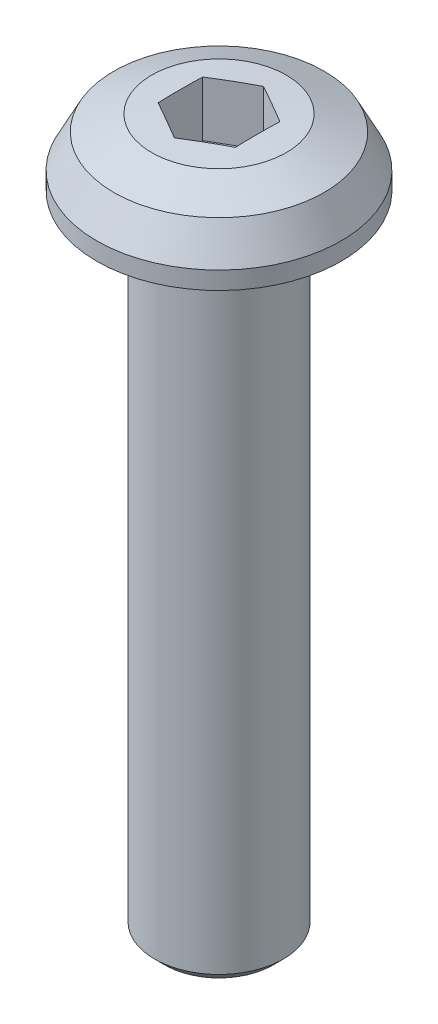
ISO-10303-21;
HEADER;
FILE_DESCRIPTION(('STEP AP214'),'2;1');
FILE_NAME('part.step','',(''),(''),'','','');
FILE_SCHEMA(('AUTOMOTIVE_DESIGN { 1 0 10303 214 1 1 1 1 }'));
ENDSEC;
DATA;
#1=APPLICATION_CONTEXT('core data for automotive mechanical design processes');
#2=APPLICATION_PROTOCOL_DEFINITION('international standard','automotive_design',2000,#1);
#3=PRODUCT_CONTEXT('',#1,'mechanical');
#4=PRODUCT('Part','Part','',(#3));
#5=PRODUCT_RELATED_PRODUCT_CATEGORY('part','',(#4));
#6=PRODUCT_DEFINITION_FORMATION('','',#4);
#7=PRODUCT_DEFINITION_CONTEXT('part definition',#1,'design');
#8=PRODUCT_DEFINITION('design','',#6,#7);
#9=PRODUCT_DEFINITION_SHAPE('','',#8);
#10=(LENGTH_UNIT() NAMED_UNIT(*) SI_UNIT(.MILLI.,.METRE.));
#11=(NAMED_UNIT(*) PLANE_ANGLE_UNIT() SI_UNIT($,.RADIAN.));
#12=(NAMED_UNIT(*) SI_UNIT($,.STERADIAN.) SOLID_ANGLE_UNIT());
#13=UNCERTAINTY_MEASURE_WITH_UNIT(LENGTH_MEASURE(1.E-05),#10,'distance_accuracy_value','');
#14=(GEOMETRIC_REPRESENTATION_CONTEXT(3) GLOBAL_UNCERTAINTY_ASSIGNED_CONTEXT((#13)) GLOBAL_UNIT_ASSIGNED_CONTEXT((#10,
#11,#12)) REPRESENTATION_CONTEXT('',''));
#15=CARTESIAN_POINT('',(0.,0.,0.));
#16=DIRECTION('',(0.,0.,1.));
#17=DIRECTION('',(1.,0.,0.));
#18=AXIS2_PLACEMENT_3D('',#15,#16,#17);
#19=CARTESIAN_POINT('',(0.,-25.,0.));
#20=DIRECTION('',(0.,-1.,0.));
#21=DIRECTION('',(0.,0.,-1.));
#22=AXIS2_PLACEMENT_3D('',#19,#20,#21);
#23=PLANE('',#22);
#24=CARTESIAN_POINT('',(0.,-25.,0.));
#25=DIRECTION('',(0.,-1.,0.));
#26=DIRECTION('',(0.,0.,-1.));
#27=AXIS2_PLACEMENT_3D('',#24,#25,#26);
#28=CIRCLE('',#27,2.1);
#29=CARTESIAN_POINT('',(0.,-25.,-2.1));
#30=VERTEX_POINT('',#29);
#31=EDGE_CURVE('E156',#30,#30,#28,.T.);
#32=ORIENTED_EDGE('',*,*,#31,.T.);
#33=EDGE_LOOP('',(#32));
#34=FACE_BOUND('',#33,.T.);
#35=ADVANCED_FACE('F41',(#34),#23,.T.);
#36=CARTESIAN_POINT('',(0.,-25.,0.));
#37=DIRECTION('',(0.,1.,0.));
#38=DIRECTION('',(0.,0.,1.));
#39=AXIS2_PLACEMENT_3D('',#36,#37,#38);
#40=CONICAL_SURFACE('',#39,2.1,0.785398163397447);
#41=CARTESIAN_POINT('',(0.,-24.6,0.));
#42=DIRECTION('',(0.,-1.,0.));
#43=DIRECTION('',(0.,0.,-1.));
#44=AXIS2_PLACEMENT_3D('',#41,#42,#43);
#45=CIRCLE('',#44,2.5);
#46=CARTESIAN_POINT('',(0.,-24.6,-2.5));
#47=VERTEX_POINT('',#46);
#48=EDGE_CURVE('E153',#47,#47,#45,.T.);
#49=ORIENTED_EDGE('',*,*,#48,.T.);
#50=EDGE_LOOP('',(#49));
#51=FACE_BOUND('',#50,.T.);
#52=ORIENTED_EDGE('',*,*,#31,.F.);
#53=EDGE_LOOP('',(#52));
#54=FACE_BOUND('',#53,.T.);
#55=ADVANCED_FACE('F193',(#51,#54),#40,.T.);
#56=CARTESIAN_POINT('',(0.,-10.,0.));
#57=DIRECTION('',(0.,-1.,0.));
#58=DIRECTION('',(0.,0.,-1.));
#59=AXIS2_PLACEMENT_3D('',#56,#57,#58);
#60=CYLINDRICAL_SURFACE('',#59,2.5);
#61=CARTESIAN_POINT('',(0.,0.,0.));
#62=DIRECTION('',(0.,-1.,0.));
#63=DIRECTION('',(0.,0.,-1.));
#64=AXIS2_PLACEMENT_3D('',#61,#62,#63);
#65=CIRCLE('',#64,2.5);
#66=CARTESIAN_POINT('',(0.,0.,-2.5));
#67=VERTEX_POINT('',#66);
#68=EDGE_CURVE('E150',#67,#67,#65,.T.);
#69=ORIENTED_EDGE('',*,*,#68,.T.);
#70=EDGE_LOOP('',(#69));
#71=FACE_BOUND('',#70,.T.);
#72=ORIENTED_EDGE('',*,*,#48,.F.);
#73=EDGE_LOOP('',(#72));
#74=FACE_BOUND('',#73,.T.);
#75=ADVANCED_FACE('F198',(#71,#74),#60,.T.);
#76=CARTESIAN_POINT('',(2.5,0.,0.));
#77=DIRECTION('',(0.,-1.,0.));
#78=DIRECTION('',(0.,0.,-1.));
#79=AXIS2_PLACEMENT_3D('',#76,#77,#78);
#80=PLANE('',#79);
#81=CARTESIAN_POINT('',(0.,0.,0.));
#82=DIRECTION('',(0.,-1.,0.));
#83=DIRECTION('',(0.,0.,-1.));
#84=AXIS2_PLACEMENT_3D('',#81,#82,#83);
#85=CIRCLE('',#84,4.75);
#86=CARTESIAN_POINT('',(0.,0.,-4.75));
#87=VERTEX_POINT('',#86);
#88=EDGE_CURVE('E147',#87,#87,#85,.T.);
#89=ORIENTED_EDGE('',*,*,#88,.T.);
#90=EDGE_LOOP('',(#89));
#91=FACE_BOUND('',#90,.T.);
#92=ORIENTED_EDGE('',*,*,#68,.F.);
#93=EDGE_LOOP('',(#92));
#94=FACE_BOUND('',#93,.T.);
#95=ADVANCED_FACE('F206',(#91,#94),#80,.T.);
#96=CARTESIAN_POINT('',(0.,-10.,0.));
#97=DIRECTION('',(0.,-1.,0.));
#98=DIRECTION('',(0.,0.,-1.));
#99=AXIS2_PLACEMENT_3D('',#96,#97,#98);
#100=CYLINDRICAL_SURFACE('',#99,4.75);
#101=CARTESIAN_POINT('',(0.,0.687500000000001,0.));
#102=DIRECTION('',(0.,-1.,0.));
#103=DIRECTION('',(0.,0.,-1.));
#104=AXIS2_PLACEMENT_3D('',#101,#102,#103);
#105=CIRCLE('',#104,4.75);
#106=CARTESIAN_POINT('',(0.,0.687500000000001,-4.75));
#107=VERTEX_POINT('',#106);
#108=EDGE_CURVE('E144',#107,#107,#105,.T.);
#109=ORIENTED_EDGE('',*,*,#108,.T.);
#110=EDGE_LOOP('',(#109));
#111=FACE_BOUND('',#110,.T.);
#112=ORIENTED_EDGE('',*,*,#88,.F.);
#113=EDGE_LOOP('',(#112));
#114=FACE_BOUND('',#113,.T.);
#115=ADVANCED_FACE('F212',(#111,#114),#100,.T.);
#116=CARTESIAN_POINT('',(0.,0.687500000000001,0.));
#117=DIRECTION('',(0.,-1.,0.));
#118=DIRECTION('',(0.,0.,-1.));
#119=AXIS2_PLACEMENT_3D('',#116,#117,#118);
#120=CONICAL_SURFACE('',#119,4.75,0.475185558518265);
#121=CARTESIAN_POINT('',(0.,1.98,0.));
#122=DIRECTION('',(0.,-1.,0.));
#123=DIRECTION('',(0.,0.,-1.));
#124=AXIS2_PLACEMENT_3D('',#121,#122,#123);
#125=CIRCLE('',#124,4.085);
#126=CARTESIAN_POINT('',(0.,1.98,-4.085));
#127=VERTEX_POINT('',#126);
#128=EDGE_CURVE('E141',#127,#127,#125,.T.);
#129=ORIENTED_EDGE('',*,*,#128,.T.);
#130=EDGE_LOOP('',(#129));
#131=FACE_BOUND('',#130,.T.);
#132=ORIENTED_EDGE('',*,*,#108,.F.);
#133=EDGE_LOOP('',(#132));
#134=FACE_BOUND('',#133,.T.);
#135=ADVANCED_FACE('F216',(#131,#134),#120,.T.);
#136=CARTESIAN_POINT('',(0.,1.98,0.));
#137=DIRECTION('',(0.,-1.,0.));
#138=DIRECTION('',(0.,0.,-1.));
#139=AXIS2_PLACEMENT_3D('',#136,#137,#138);
#140=CONICAL_SURFACE('',#139,4.085,1.18095805376664);
#141=CARTESIAN_POINT('',(0.,2.585,0.));
#142=DIRECTION('',(0.,-1.,0.));
#143=DIRECTION('',(0.,0.,-1.));
#144=AXIS2_PLACEMENT_3D('',#141,#142,#143);
#145=CIRCLE('',#144,2.6125);
#146=CARTESIAN_POINT('',(0.,2.585,-2.6125));
#147=VERTEX_POINT('',#146);
#148=EDGE_CURVE('E129',#147,#147,#145,.T.);
#149=ORIENTED_EDGE('',*,*,#148,.T.);
#150=EDGE_LOOP('',(#149));
#151=FACE_BOUND('',#150,.T.);
#152=ORIENTED_EDGE('',*,*,#128,.F.);
#153=EDGE_LOOP('',(#152));
#154=FACE_BOUND('',#153,.T.);
#155=ADVANCED_FACE('F190',(#151,#154),#140,.T.);
#156=CARTESIAN_POINT('',(0.,2.585,0.));
#157=DIRECTION('',(0.,-1.,0.));
#158=DIRECTION('',(0.,0.,-1.));
#159=AXIS2_PLACEMENT_3D('',#156,#157,#158);
#160=CONICAL_SURFACE('',#159,2.6125,1.50772220889798);
#161=CARTESIAN_POINT('',(1.5,2.560086309188,2.60611764182678));
#162=CARTESIAN_POINT('',(1.5,2.56693880295416,2.48076908626678));
#163=CARTESIAN_POINT('',(1.5,2.57368529872115,2.35541457200931));
#164=CARTESIAN_POINT('',(1.5,2.58683002538783,2.10468586531663));
#165=CARTESIAN_POINT('',(1.5,2.5932282521772,1.97931167266667));
#166=CARTESIAN_POINT('',(1.5,2.60554318572624,1.72847399636716));
#167=CARTESIAN_POINT('',(1.5,2.61145964188796,1.60301050006051));
#168=CARTESIAN_POINT('',(1.5,2.62258337856353,1.35205277534172));
#169=CARTESIAN_POINT('',(1.5,2.62779065640743,1.22655854681567));
#170=CARTESIAN_POINT('',(1.5,2.64184565054799,0.850405596673332));
#171=CARTESIAN_POINT('',(1.5,2.64914799209055,0.599678211841999));
#172=CARTESIAN_POINT('',(1.5,2.65452690718478,0.223533565281367));
#173=CARTESIAN_POINT('',(1.5,2.65539100744672,0.0981579717602855));
#174=CARTESIAN_POINT('',(1.5,2.6551041219456,-0.152590972629411));
#175=CARTESIAN_POINT('',(1.5,2.65395313305011,-0.277964323494237));
#176=CARTESIAN_POINT('',(1.5,2.64888891333641,-0.586915084332876));
#177=CARTESIAN_POINT('',(1.5,2.64394087253405,-0.770474724862048));
#178=CARTESIAN_POINT('',(1.5,2.63151083532879,-1.13753450590357));
#179=CARTESIAN_POINT('',(1.5,2.62402837189799,-1.32103462920576));
#180=CARTESIAN_POINT('',(1.5,2.60760331162556,-1.68818507119781));
#181=CARTESIAN_POINT('',(1.5,2.59865900026496,-1.87183531122401));
#182=CARTESIAN_POINT('',(1.5,2.58460569077659,-2.14724894720027));
#183=CARTESIAN_POINT('',(1.5,2.57981590496685,-2.23902899568071));
#184=CARTESIAN_POINT('',(1.5,2.57006714596731,-2.42257971914173));
#185=CARTESIAN_POINT('',(1.5,2.56510817351475,-2.51435039416143));
#186=CARTESIAN_POINT('',(1.5,2.560086309188,-2.60611764182678));
#187=B_SPLINE_CURVE_WITH_KNOTS('',3,(#161,#162,#163,#164,#165,#166,#167,#168,#169,#170,#171,
#172,#173,#174,#175,#176,#177,#178,#179,#180,#181,#182,#183,#184,#185,#186),.UNSPECIFIED.,.F.,
.F.,(4,2,2,2,2,2,2,2,2,2,2,2,4),(0.,0.376607265441586,0.753218974700062,1.13002534740853,
1.50683313869845,2.25925183627969,2.63537191500764,3.01149257840772,3.56234045527837,
4.11328989430266,4.66489020997614,4.94060497932327,5.21631854740567),.UNSPECIFIED.);
#188=CARTESIAN_POINT('',(1.5,2.6406073174167,0.866025403784439));
#189=VERTEX_POINT('',#188);
#190=CARTESIAN_POINT('',(1.5,2.6406073174167,-0.866025403784438));
#191=VERTEX_POINT('',#190);
#192=EDGE_CURVE('E11',#189,#191,#187,.T.);
#193=ORIENTED_EDGE('',*,*,#192,.F.);
#194=CARTESIAN_POINT('',(-0.000199999999999894,2.64060002384196,1.73216627762272));
#195=CARTESIAN_POINT('',(0.0623052328910305,2.6428788982063,1.69607886458732));
#196=CARTESIAN_POINT('',(0.124816428078966,2.6449454416361,1.6599880092182));
#197=CARTESIAN_POINT('',(0.249851117971786,2.64857076256674,1.58779919735054));
#198=CARTESIAN_POINT('',(0.312374612911773,2.65012952917297,1.55170124071626));
#199=CARTESIAN_POINT('',(0.499922087623552,2.65391859893502,1.44342065570558));
#200=CARTESIAN_POINT('',(0.624961043811776,2.65526315789474,1.37122938069112));
#201=CARTESIAN_POINT('',(0.875038956188224,2.65526315789474,1.2268468306622));
#202=CARTESIAN_POINT('',(1.00007791237645,2.65391859893502,1.15465555564774));
#203=CARTESIAN_POINT('',(1.18762538708823,2.65012952917297,1.04637497063706));
#204=CARTESIAN_POINT('',(1.25014888202821,2.64857076256674,1.01027701400278));
#205=CARTESIAN_POINT('',(1.37518357192103,2.6449454416361,0.938088202135117));
#206=CARTESIAN_POINT('',(1.43769476710897,2.6428788982063,0.901997346765998));
#207=CARTESIAN_POINT('',(1.5002,2.64060002384196,0.865909933730601));
#208=B_SPLINE_CURVE_WITH_KNOTS('',3,(#194,#195,#196,#197,#198,#199,#200,#201,#202,#203,#204,
#205,#206,#207),.UNSPECIFIED.,.F.,.F.,(4,2,2,2,2,2,4),(0.,0.216632117546511,0.43326888273534,
0.866410762592288,1.29955264244924,1.51618940763806,1.73282152518458),.UNSPECIFIED.);
#209=CARTESIAN_POINT('',(0.,2.6406073174167,1.73205080756888));
#210=VERTEX_POINT('',#209);
#211=EDGE_CURVE('E54',#210,#189,#208,.T.);
#212=ORIENTED_EDGE('',*,*,#211,.F.);
#213=CARTESIAN_POINT('',(-1.5002,2.64060002384196,0.865909933730602));
#214=CARTESIAN_POINT('',(-1.43769476710897,2.6428788982063,0.901997346765998));
#215=CARTESIAN_POINT('',(-1.37518357192103,2.6449454416361,0.938088202135118));
#216=CARTESIAN_POINT('',(-1.25014888202821,2.64857076256674,1.01027701400278));
#217=CARTESIAN_POINT('',(-1.18762538708823,2.65012952917297,1.04637497063706));
#218=CARTESIAN_POINT('',(-1.00007791237645,2.65391859893502,1.15465555564774));
#219=CARTESIAN_POINT('',(-0.875038956188224,2.65526315789474,1.2268468306622));
#220=CARTESIAN_POINT('',(-0.624961043811775,2.65526315789474,1.37122938069112));
#221=CARTESIAN_POINT('',(-0.499922087623551,2.65391859893502,1.44342065570558));
#222=CARTESIAN_POINT('',(-0.312374612911772,2.65012952917297,1.55170124071626));
#223=CARTESIAN_POINT('',(-0.249851117971785,2.64857076256674,1.58779919735054));
#224=CARTESIAN_POINT('',(-0.124816428078965,2.6449454416361,1.6599880092182));
#225=CARTESIAN_POINT('',(-0.0623052328910301,2.6428788982063,1.69607886458732));
#226=CARTESIAN_POINT('',(0.000200000000000383,2.64060002384196,1.73216627762272));
#227=B_SPLINE_CURVE_WITH_KNOTS('',3,(#213,#214,#215,#216,#217,#218,#219,#220,#221,#222,#223,
#224,#225,#226),.UNSPECIFIED.,.F.,.F.,(4,2,2,2,2,2,4),(0.,0.216632117546511,0.43326888273534,
0.866410762592288,1.29955264244924,1.51618940763807,1.73282152518458),.UNSPECIFIED.);
#228=CARTESIAN_POINT('',(-1.5,2.6406073174167,0.866025403784439));
#229=VERTEX_POINT('',#228);
#230=EDGE_CURVE('E304',#229,#210,#227,.T.);
#231=ORIENTED_EDGE('',*,*,#230,.F.);
#232=CARTESIAN_POINT('',(-1.5,2.560086309188,-2.60611764182678));
#233=CARTESIAN_POINT('',(-1.5,2.56693880295416,-2.48076908626678));
#234=CARTESIAN_POINT('',(-1.5,2.57368529872115,-2.35541457200931));
#235=CARTESIAN_POINT('',(-1.5,2.58683002538783,-2.10468586531663));
#236=CARTESIAN_POINT('',(-1.5,2.5932282521772,-1.97931167266668));
#237=CARTESIAN_POINT('',(-1.5,2.60554318572624,-1.72847399636717));
#238=CARTESIAN_POINT('',(-1.5,2.61145964188796,-1.60301050006051));
#239=CARTESIAN_POINT('',(-1.5,2.62258337856353,-1.35205277534172));
#240=CARTESIAN_POINT('',(-1.5,2.62779065640743,-1.22655854681567));
#241=CARTESIAN_POINT('',(-1.5,2.64184565054799,-0.850405596673332));
#242=CARTESIAN_POINT('',(-1.5,2.64914799209055,-0.599678211841999));
#243=CARTESIAN_POINT('',(-1.5,2.65452690718478,-0.223533565281368));
#244=CARTESIAN_POINT('',(-1.5,2.65539100744672,-0.098157971760286));
#245=CARTESIAN_POINT('',(-1.5,2.6551041219456,0.15259097262941));
#246=CARTESIAN_POINT('',(-1.5,2.65395313305011,0.277964323494236));
#247=CARTESIAN_POINT('',(-1.5,2.64888891333641,0.586915084332875));
#248=CARTESIAN_POINT('',(-1.5,2.64394087253405,0.770474724862048));
#249=CARTESIAN_POINT('',(-1.5,2.63151083532879,1.13753450590357));
#250=CARTESIAN_POINT('',(-1.5,2.62402837189799,1.32103462920576));
#251=CARTESIAN_POINT('',(-1.5,2.60760331162556,1.68818507119781));
#252=CARTESIAN_POINT('',(-1.5,2.59865900026496,1.87183531122401));
#253=CARTESIAN_POINT('',(-1.5,2.58460569077659,2.14724894720027));
#254=CARTESIAN_POINT('',(-1.5,2.57981590496685,2.23902899568071));
#255=CARTESIAN_POINT('',(-1.5,2.57006714596731,2.42257971914173));
#256=CARTESIAN_POINT('',(-1.5,2.56510817351475,2.51435039416143));
#257=CARTESIAN_POINT('',(-1.5,2.560086309188,2.60611764182678));
#258=B_SPLINE_CURVE_WITH_KNOTS('',3,(#232,#233,#234,#235,#236,#237,#238,#239,#240,#241,#242,
#243,#244,#245,#246,#247,#248,#249,#250,#251,#252,#253,#254,#255,#256,#257),.UNSPECIFIED.,.F.,
.F.,(4,2,2,2,2,2,2,2,2,2,2,2,4),(0.,0.376607265441586,0.753218974700062,1.13002534740853,
1.50683313869845,2.25925183627969,2.63537191500764,3.01149257840772,3.56234045527837,
4.11328989430267,4.66489020997614,4.94060497932327,5.21631854740568),.UNSPECIFIED.);
#259=CARTESIAN_POINT('',(-1.5,2.6406073174167,-0.866025403784438));
#260=VERTEX_POINT('',#259);
#261=EDGE_CURVE('E309',#260,#229,#258,.T.);
#262=ORIENTED_EDGE('',*,*,#261,.F.);
#263=CARTESIAN_POINT('',(0.000199999999999682,2.64060002384196,-1.73216627762272));
#264=CARTESIAN_POINT('',(-0.0623052328910307,2.6428788982063,-1.69607886458732));
#265=CARTESIAN_POINT('',(-0.124816428078966,2.6449454416361,-1.6599880092182));
#266=CARTESIAN_POINT('',(-0.249851117971786,2.64857076256674,-1.58779919735054));
#267=CARTESIAN_POINT('',(-0.312374612911773,2.65012952917297,-1.55170124071626));
#268=CARTESIAN_POINT('',(-0.499922087623552,2.65391859893502,-1.44342065570558));
#269=CARTESIAN_POINT('',(-0.624961043811776,2.65526315789474,-1.37122938069112));
#270=CARTESIAN_POINT('',(-0.875038956188225,2.65526315789474,-1.2268468306622));
#271=CARTESIAN_POINT('',(-1.00007791237645,2.65391859893502,-1.15465555564774));
#272=CARTESIAN_POINT('',(-1.18762538708823,2.65012952917297,-1.04637497063706));
#273=CARTESIAN_POINT('',(-1.25014888202821,2.64857076256674,-1.01027701400278));
#274=CARTESIAN_POINT('',(-1.37518357192103,2.6449454416361,-0.938088202135117));
#275=CARTESIAN_POINT('',(-1.43769476710897,2.6428788982063,-0.901997346765997));
#276=CARTESIAN_POINT('',(-1.5002,2.64060002384196,-0.8659099337306));
#277=B_SPLINE_CURVE_WITH_KNOTS('',3,(#263,#264,#265,#266,#267,#268,#269,#270,#271,#272,#273,
#274,#275,#276),.UNSPECIFIED.,.F.,.F.,(4,2,2,2,2,2,4),(0.,0.216632117546511,0.43326888273534,
0.866410762592288,1.29955264244924,1.51618940763807,1.73282152518458),.UNSPECIFIED.);
#278=CARTESIAN_POINT('',(0.,2.6406073174167,-1.73205080756888));
#279=VERTEX_POINT('',#278);
#280=EDGE_CURVE('E166',#279,#260,#277,.T.);
#281=ORIENTED_EDGE('',*,*,#280,.F.);
#282=CARTESIAN_POINT('',(1.5002,2.64060002384196,-0.8659099337306));
#283=CARTESIAN_POINT('',(1.43769476710897,2.6428788982063,-0.901997346765997));
#284=CARTESIAN_POINT('',(1.37518357192103,2.6449454416361,-0.938088202135117));
#285=CARTESIAN_POINT('',(1.25014888202821,2.64857076256674,-1.01027701400278));
#286=CARTESIAN_POINT('',(1.18762538708823,2.65012952917297,-1.04637497063706));
#287=CARTESIAN_POINT('',(1.00007791237645,2.65391859893502,-1.15465555564774));
#288=CARTESIAN_POINT('',(0.875038956188224,2.65526315789474,-1.2268468306622));
#289=CARTESIAN_POINT('',(0.624961043811776,2.65526315789474,-1.37122938069112));
#290=CARTESIAN_POINT('',(0.499922087623551,2.65391859893502,-1.44342065570558));
#291=CARTESIAN_POINT('',(0.312374612911773,2.65012952917297,-1.55170124071626));
#292=CARTESIAN_POINT('',(0.249851117971785,2.64857076256674,-1.58779919735054));
#293=CARTESIAN_POINT('',(0.124816428078965,2.6449454416361,-1.6599880092182));
#294=CARTESIAN_POINT('',(0.0623052328910298,2.6428788982063,-1.69607886458732));
#295=CARTESIAN_POINT('',(-0.000200000000000599,2.64060002384196,-1.73216627762272));
#296=B_SPLINE_CURVE_WITH_KNOTS('',3,(#282,#283,#284,#285,#286,#287,#288,#289,#290,#291,#292,
#293,#294,#295),.UNSPECIFIED.,.F.,.F.,(4,2,2,2,2,2,4),(0.,0.216632117546511,0.43326888273534,
0.866410762592288,1.29955264244924,1.51618940763807,1.73282152518458),.UNSPECIFIED.);
#297=EDGE_CURVE('E159',#191,#279,#296,.T.);
#298=ORIENTED_EDGE('',*,*,#297,.F.);
#299=EDGE_LOOP('',(#193,#212,#231,#262,#281,#298));
#300=FACE_BOUND('',#299,.T.);
#301=ORIENTED_EDGE('',*,*,#148,.F.);
#302=EDGE_LOOP('',(#301));
#303=FACE_BOUND('',#302,.T.);
#304=ADVANCED_FACE('F173',(#300,#303),#160,.T.);
#305=CARTESIAN_POINT('',(1.5,0.5,-0.866025403784438));
#306=DIRECTION('',(1.,0.,0.));
#307=DIRECTION('',(0.,0.,-1.));
#308=AXIS2_PLACEMENT_3D('',#305,#306,#307);
#309=PLANE('',#308);
#310=ORIENTED_EDGE('',*,*,#192,.T.);
#311=DIRECTION('',(0.,1.,0.));
#312=VECTOR('',#311,1.);
#313=CARTESIAN_POINT('',(1.5,0.5,-0.866025403784438));
#314=LINE('',#313,#312);
#315=CARTESIAN_POINT('',(1.5,0.5,-0.866025403784438));
#316=VERTEX_POINT('',#315);
#317=EDGE_CURVE('E61',#316,#191,#314,.T.);
#318=ORIENTED_EDGE('',*,*,#317,.F.);
#319=DIRECTION('',(0.,0.,-1.));
#320=VECTOR('',#319,1.);
#321=CARTESIAN_POINT('',(1.5,0.5,-0.866025403784438));
#322=LINE('',#321,#320);
#323=CARTESIAN_POINT('',(1.5,0.5,0.866025403784439));
#324=VERTEX_POINT('',#323);
#325=EDGE_CURVE('E99',#324,#316,#322,.T.);
#326=ORIENTED_EDGE('',*,*,#325,.F.);
#327=DIRECTION('',(0.,1.,0.));
#328=VECTOR('',#327,1.);
#329=CARTESIAN_POINT('',(1.5,0.5,0.866025403784439));
#330=LINE('',#329,#328);
#331=EDGE_CURVE('E127',#324,#189,#330,.T.);
#332=ORIENTED_EDGE('',*,*,#331,.T.);
#333=EDGE_LOOP('',(#310,#318,#326,#332));
#334=FACE_BOUND('',#333,.T.);
#335=ADVANCED_FACE('F97',(#334),#309,.F.);
#336=CARTESIAN_POINT('',(1.5,0.5,0.866025403784439));
#337=DIRECTION('',(0.5,0.,0.866025403784439));
#338=DIRECTION('',(0.866025403784439,0.,-0.5));
#339=AXIS2_PLACEMENT_3D('',#336,#337,#338);
#340=PLANE('',#339);
#341=ORIENTED_EDGE('',*,*,#211,.T.);
#342=ORIENTED_EDGE('',*,*,#331,.F.);
#343=DIRECTION('',(0.866025403784439,0.,-0.5));
#344=VECTOR('',#343,1.);
#345=CARTESIAN_POINT('',(1.5,0.5,0.866025403784439));
#346=LINE('',#345,#344);
#347=CARTESIAN_POINT('',(0.,0.5,1.73205080756888));
#348=VERTEX_POINT('',#347);
#349=EDGE_CURVE('E104',#348,#324,#346,.T.);
#350=ORIENTED_EDGE('',*,*,#349,.F.);
#351=DIRECTION('',(0.,1.,0.));
#352=VECTOR('',#351,1.);
#353=CARTESIAN_POINT('',(0.,0.5,1.73205080756888));
#354=LINE('',#353,#352);
#355=EDGE_CURVE('E130',#348,#210,#354,.T.);
#356=ORIENTED_EDGE('',*,*,#355,.T.);
#357=EDGE_LOOP('',(#341,#342,#350,#356));
#358=FACE_BOUND('',#357,.T.);
#359=ADVANCED_FACE('F183',(#358),#340,.F.);
#360=CARTESIAN_POINT('',(0.,0.5,1.73205080756888));
#361=DIRECTION('',(-0.5,0.,0.866025403784439));
#362=DIRECTION('',(0.866025403784439,0.,0.5));
#363=AXIS2_PLACEMENT_3D('',#360,#361,#362);
#364=PLANE('',#363);
#365=ORIENTED_EDGE('',*,*,#230,.T.);
#366=ORIENTED_EDGE('',*,*,#355,.F.);
#367=DIRECTION('',(0.866025403784439,0.,0.5));
#368=VECTOR('',#367,1.);
#369=CARTESIAN_POINT('',(0.,0.5,1.73205080756888));
#370=LINE('',#369,#368);
#371=CARTESIAN_POINT('',(-1.5,0.5,0.866025403784439));
#372=VERTEX_POINT('',#371);
#373=EDGE_CURVE('E124',#372,#348,#370,.T.);
#374=ORIENTED_EDGE('',*,*,#373,.F.);
#375=DIRECTION('',(0.,1.,0.));
#376=VECTOR('',#375,1.);
#377=CARTESIAN_POINT('',(-1.5,0.5,0.866025403784439));
#378=LINE('',#377,#376);
#379=EDGE_CURVE('E132',#372,#229,#378,.T.);
#380=ORIENTED_EDGE('',*,*,#379,.T.);
#381=EDGE_LOOP('',(#365,#366,#374,#380));
#382=FACE_BOUND('',#381,.T.);
#383=ADVANCED_FACE('F188',(#382),#364,.F.);
#384=CARTESIAN_POINT('',(-1.5,0.5,0.866025403784439));
#385=DIRECTION('',(-1.,0.,0.));
#386=DIRECTION('',(0.,0.,1.));
#387=AXIS2_PLACEMENT_3D('',#384,#385,#386);
#388=PLANE('',#387);
#389=ORIENTED_EDGE('',*,*,#261,.T.);
#390=ORIENTED_EDGE('',*,*,#379,.F.);
#391=DIRECTION('',(0.,0.,1.));
#392=VECTOR('',#391,1.);
#393=CARTESIAN_POINT('',(-1.5,0.5,0.866025403784439));
#394=LINE('',#393,#392);
#395=CARTESIAN_POINT('',(-1.5,0.5,-0.866025403784438));
#396=VERTEX_POINT('',#395);
#397=EDGE_CURVE('E121',#396,#372,#394,.T.);
#398=ORIENTED_EDGE('',*,*,#397,.F.);
#399=DIRECTION('',(0.,1.,0.));
#400=VECTOR('',#399,1.);
#401=CARTESIAN_POINT('',(-1.5,0.5,-0.866025403784438));
#402=LINE('',#401,#400);
#403=EDGE_CURVE('E135',#396,#260,#402,.T.);
#404=ORIENTED_EDGE('',*,*,#403,.T.);
#405=EDGE_LOOP('',(#389,#390,#398,#404));
#406=FACE_BOUND('',#405,.T.);
#407=ADVANCED_FACE('F263',(#406),#388,.F.);
#408=CARTESIAN_POINT('',(-1.5,0.5,-0.866025403784438));
#409=DIRECTION('',(-0.5,0.,-0.866025403784438));
#410=DIRECTION('',(-0.866025403784439,0.,0.5));
#411=AXIS2_PLACEMENT_3D('',#408,#409,#410);
#412=PLANE('',#411);
#413=ORIENTED_EDGE('',*,*,#280,.T.);
#414=ORIENTED_EDGE('',*,*,#403,.F.);
#415=DIRECTION('',(-0.866025403784438,0.,0.5));
#416=VECTOR('',#415,1.);
#417=CARTESIAN_POINT('',(-1.5,0.5,-0.866025403784438));
#418=LINE('',#417,#416);
#419=CARTESIAN_POINT('',(0.,0.5,-1.73205080756888));
#420=VERTEX_POINT('',#419);
#421=EDGE_CURVE('E113',#420,#396,#418,.T.);
#422=ORIENTED_EDGE('',*,*,#421,.F.);
#423=DIRECTION('',(0.,1.,0.));
#424=VECTOR('',#423,1.);
#425=CARTESIAN_POINT('',(0.,0.5,-1.73205080756888));
#426=LINE('',#425,#424);
#427=EDGE_CURVE('E103',#420,#279,#426,.T.);
#428=ORIENTED_EDGE('',*,*,#427,.T.);
#429=EDGE_LOOP('',(#413,#414,#422,#428));
#430=FACE_BOUND('',#429,.T.);
#431=ADVANCED_FACE('F178',(#430),#412,.F.);
#432=CARTESIAN_POINT('',(0.,0.5,-1.73205080756888));
#433=DIRECTION('',(0.5,0.,-0.866025403784439));
#434=DIRECTION('',(-0.866025403784439,0.,-0.5));
#435=AXIS2_PLACEMENT_3D('',#432,#433,#434);
#436=PLANE('',#435);
#437=ORIENTED_EDGE('',*,*,#297,.T.);
#438=ORIENTED_EDGE('',*,*,#427,.F.);
#439=DIRECTION('',(-0.866025403784439,0.,-0.5));
#440=VECTOR('',#439,1.);
#441=CARTESIAN_POINT('',(0.,0.5,-1.73205080756888));
#442=LINE('',#441,#440);
#443=EDGE_CURVE('E107',#316,#420,#442,.T.);
#444=ORIENTED_EDGE('',*,*,#443,.F.);
#445=ORIENTED_EDGE('',*,*,#317,.T.);
#446=EDGE_LOOP('',(#437,#438,#444,#445));
#447=FACE_BOUND('',#446,.T.);
#448=ADVANCED_FACE('F108',(#447),#436,.F.);
#449=CARTESIAN_POINT('',(0.,0.5,0.));
#450=DIRECTION('',(0.,-1.,0.));
#451=DIRECTION('',(0.,0.,-1.));
#452=AXIS2_PLACEMENT_3D('',#449,#450,#451);
#453=PLANE('',#452);
#454=ORIENTED_EDGE('',*,*,#325,.T.);
#455=ORIENTED_EDGE('',*,*,#443,.T.);
#456=ORIENTED_EDGE('',*,*,#421,.T.);
#457=ORIENTED_EDGE('',*,*,#397,.T.);
#458=ORIENTED_EDGE('',*,*,#373,.T.);
#459=ORIENTED_EDGE('',*,*,#349,.T.);
#460=EDGE_LOOP('',(#454,#455,#456,#457,#458,#459));
#461=FACE_BOUND('',#460,.T.);
#462=ADVANCED_FACE('F115',(#461),#453,.F.);
#463=CLOSED_SHELL('',(#35,#55,#75,#95,#115,#135,#155,#304,#335,#359,#383,#407,#431,#448,#462));
#464=MANIFOLD_SOLID_BREP('B2',#463);
#465=ADVANCED_BREP_SHAPE_REPRESENTATION('',(#18,#464),#14);
#466=SHAPE_DEFINITION_REPRESENTATION(#9,#465);
ENDSEC;
END-ISO-10303-21;
